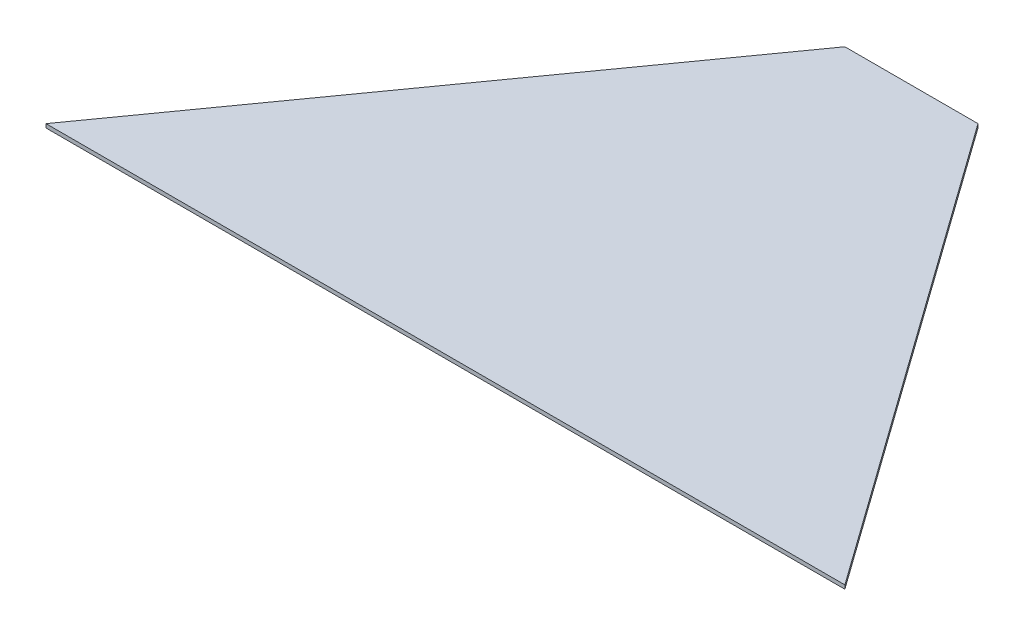
ISO-10303-21;
HEADER;
FILE_DESCRIPTION(('STEP AP214'),'2;1');
FILE_NAME('part.step','',(''),(''),'','','');
FILE_SCHEMA(('AUTOMOTIVE_DESIGN { 1 0 10303 214 1 1 1 1 }'));
ENDSEC;
DATA;
#1=APPLICATION_CONTEXT('core data for automotive mechanical design processes');
#2=APPLICATION_PROTOCOL_DEFINITION('international standard','automotive_design',2000,#1);
#3=PRODUCT_CONTEXT('',#1,'mechanical');
#4=PRODUCT('Part','Part','',(#3));
#5=PRODUCT_RELATED_PRODUCT_CATEGORY('part','',(#4));
#6=PRODUCT_DEFINITION_FORMATION('','',#4);
#7=PRODUCT_DEFINITION_CONTEXT('part definition',#1,'design');
#8=PRODUCT_DEFINITION('design','',#6,#7);
#9=PRODUCT_DEFINITION_SHAPE('','',#8);
#10=(LENGTH_UNIT() NAMED_UNIT(*) SI_UNIT(.MILLI.,.METRE.));
#11=(NAMED_UNIT(*) PLANE_ANGLE_UNIT() SI_UNIT($,.RADIAN.));
#12=(NAMED_UNIT(*) SI_UNIT($,.STERADIAN.) SOLID_ANGLE_UNIT());
#13=UNCERTAINTY_MEASURE_WITH_UNIT(LENGTH_MEASURE(1.E-05),#10,'distance_accuracy_value','');
#14=(GEOMETRIC_REPRESENTATION_CONTEXT(3) GLOBAL_UNCERTAINTY_ASSIGNED_CONTEXT((#13)) GLOBAL_UNIT_ASSIGNED_CONTEXT((#10,
#11,#12)) REPRESENTATION_CONTEXT('',''));
#15=CARTESIAN_POINT('',(0.,0.,0.));
#16=DIRECTION('',(0.,0.,1.));
#17=DIRECTION('',(1.,0.,0.));
#18=AXIS2_PLACEMENT_3D('',#15,#16,#17);
#19=CARTESIAN_POINT('',(-105.,1.,0.));
#20=DIRECTION('',(0.813733471206735,0.,0.581238193719096));
#21=DIRECTION('',(0.581238193719096,0.,-0.813733471206735));
#22=AXIS2_PLACEMENT_3D('',#19,#20,#21);
#23=PLANE('',#22);
#24=DIRECTION('',(-0.581238193719096,0.,0.813733471206735));
#25=VECTOR('',#24,1.);
#26=CARTESIAN_POINT('',(-105.,0.,0.));
#27=LINE('',#26,#25);
#28=CARTESIAN_POINT('',(-17.5,0.,-122.5));
#29=VERTEX_POINT('',#28);
#30=CARTESIAN_POINT('',(-105.,0.,0.));
#31=VERTEX_POINT('',#30);
#32=EDGE_CURVE('E96',#29,#31,#27,.T.);
#33=ORIENTED_EDGE('',*,*,#32,.T.);
#34=DIRECTION('',(0.,-1.,0.));
#35=VECTOR('',#34,1.);
#36=CARTESIAN_POINT('',(-105.,1.,0.));
#37=LINE('',#36,#35);
#38=CARTESIAN_POINT('',(-105.,1.,0.));
#39=VERTEX_POINT('',#38);
#40=EDGE_CURVE('E11',#39,#31,#37,.T.);
#41=ORIENTED_EDGE('',*,*,#40,.F.);
#42=DIRECTION('',(-0.581238193719096,0.,0.813733471206735));
#43=VECTOR('',#42,1.);
#44=CARTESIAN_POINT('',(-105.,1.,0.));
#45=LINE('',#44,#43);
#46=CARTESIAN_POINT('',(-17.5,1.,-122.5));
#47=VERTEX_POINT('',#46);
#48=EDGE_CURVE('E84',#47,#39,#45,.T.);
#49=ORIENTED_EDGE('',*,*,#48,.F.);
#50=DIRECTION('',(0.,-1.,0.));
#51=VECTOR('',#50,1.);
#52=CARTESIAN_POINT('',(-17.5,1.,-122.5));
#53=LINE('',#52,#51);
#54=EDGE_CURVE('E92',#47,#29,#53,.T.);
#55=ORIENTED_EDGE('',*,*,#54,.T.);
#56=EDGE_LOOP('',(#33,#41,#49,#55));
#57=FACE_BOUND('',#56,.T.);
#58=ADVANCED_FACE('F33',(#57),#23,.F.);
#59=CARTESIAN_POINT('',(105.,1.,0.));
#60=DIRECTION('',(0.,0.,-1.));
#61=DIRECTION('',(-1.,0.,0.));
#62=AXIS2_PLACEMENT_3D('',#59,#60,#61);
#63=PLANE('',#62);
#64=DIRECTION('',(1.,0.,0.));
#65=VECTOR('',#64,1.);
#66=CARTESIAN_POINT('',(105.,0.,0.));
#67=LINE('',#66,#65);
#68=CARTESIAN_POINT('',(105.,0.,0.));
#69=VERTEX_POINT('',#68);
#70=EDGE_CURVE('E88',#31,#69,#67,.T.);
#71=ORIENTED_EDGE('',*,*,#70,.T.);
#72=DIRECTION('',(0.,-1.,0.));
#73=VECTOR('',#72,1.);
#74=CARTESIAN_POINT('',(105.,1.,0.));
#75=LINE('',#74,#73);
#76=CARTESIAN_POINT('',(105.,1.,0.));
#77=VERTEX_POINT('',#76);
#78=EDGE_CURVE('E41',#77,#69,#75,.T.);
#79=ORIENTED_EDGE('',*,*,#78,.F.);
#80=DIRECTION('',(1.,0.,0.));
#81=VECTOR('',#80,1.);
#82=CARTESIAN_POINT('',(105.,1.,0.));
#83=LINE('',#82,#81);
#84=EDGE_CURVE('E79',#39,#77,#83,.T.);
#85=ORIENTED_EDGE('',*,*,#84,.F.);
#86=ORIENTED_EDGE('',*,*,#40,.T.);
#87=EDGE_LOOP('',(#71,#79,#85,#86));
#88=FACE_BOUND('',#87,.T.);
#89=ADVANCED_FACE('F87',(#88),#63,.F.);
#90=CARTESIAN_POINT('',(17.5,1.,-122.5));
#91=DIRECTION('',(-0.813733471206735,0.,0.581238193719097));
#92=DIRECTION('',(0.581238193719097,0.,0.813733471206735));
#93=AXIS2_PLACEMENT_3D('',#90,#91,#92);
#94=PLANE('',#93);
#95=DIRECTION('',(-0.581238193719097,0.,-0.813733471206735));
#96=VECTOR('',#95,1.);
#97=CARTESIAN_POINT('',(17.5,0.,-122.5));
#98=LINE('',#97,#96);
#99=CARTESIAN_POINT('',(17.5,0.,-122.5));
#100=VERTEX_POINT('',#99);
#101=EDGE_CURVE('E66',#69,#100,#98,.T.);
#102=ORIENTED_EDGE('',*,*,#101,.T.);
#103=DIRECTION('',(0.,-1.,0.));
#104=VECTOR('',#103,1.);
#105=CARTESIAN_POINT('',(17.5,1.,-122.5));
#106=LINE('',#105,#104);
#107=CARTESIAN_POINT('',(17.5,1.,-122.5));
#108=VERTEX_POINT('',#107);
#109=EDGE_CURVE('E89',#108,#100,#106,.T.);
#110=ORIENTED_EDGE('',*,*,#109,.F.);
#111=DIRECTION('',(-0.581238193719097,0.,-0.813733471206735));
#112=VECTOR('',#111,1.);
#113=CARTESIAN_POINT('',(17.5,1.,-122.5));
#114=LINE('',#113,#112);
#115=EDGE_CURVE('E82',#77,#108,#114,.T.);
#116=ORIENTED_EDGE('',*,*,#115,.F.);
#117=ORIENTED_EDGE('',*,*,#78,.T.);
#118=EDGE_LOOP('',(#102,#110,#116,#117));
#119=FACE_BOUND('',#118,.T.);
#120=ADVANCED_FACE('F90',(#119),#94,.F.);
#121=CARTESIAN_POINT('',(-17.5,1.,-122.5));
#122=DIRECTION('',(0.,0.,1.));
#123=DIRECTION('',(1.,0.,0.));
#124=AXIS2_PLACEMENT_3D('',#121,#122,#123);
#125=PLANE('',#124);
#126=DIRECTION('',(-1.,0.,0.));
#127=VECTOR('',#126,1.);
#128=CARTESIAN_POINT('',(-17.5,0.,-122.5));
#129=LINE('',#128,#127);
#130=EDGE_CURVE('E72',#100,#29,#129,.T.);
#131=ORIENTED_EDGE('',*,*,#130,.T.);
#132=ORIENTED_EDGE('',*,*,#54,.F.);
#133=DIRECTION('',(-1.,0.,0.));
#134=VECTOR('',#133,1.);
#135=CARTESIAN_POINT('',(-17.5,1.,-122.5));
#136=LINE('',#135,#134);
#137=EDGE_CURVE('E49',#108,#47,#136,.T.);
#138=ORIENTED_EDGE('',*,*,#137,.F.);
#139=ORIENTED_EDGE('',*,*,#109,.T.);
#140=EDGE_LOOP('',(#131,#132,#138,#139));
#141=FACE_BOUND('',#140,.T.);
#142=ADVANCED_FACE('F103',(#141),#125,.F.);
#143=CARTESIAN_POINT('',(0.,1.,0.));
#144=DIRECTION('',(0.,-1.,0.));
#145=DIRECTION('',(0.,0.,-1.));
#146=AXIS2_PLACEMENT_3D('',#143,#144,#145);
#147=PLANE('',#146);
#148=ORIENTED_EDGE('',*,*,#48,.T.);
#149=ORIENTED_EDGE('',*,*,#84,.T.);
#150=ORIENTED_EDGE('',*,*,#115,.T.);
#151=ORIENTED_EDGE('',*,*,#137,.T.);
#152=EDGE_LOOP('',(#148,#149,#150,#151));
#153=FACE_BOUND('',#152,.T.);
#154=ADVANCED_FACE('F80',(#153),#147,.F.);
#155=CARTESIAN_POINT('',(0.,0.,0.));
#156=DIRECTION('',(0.,-1.,0.));
#157=DIRECTION('',(0.,0.,-1.));
#158=AXIS2_PLACEMENT_3D('',#155,#156,#157);
#159=PLANE('',#158);
#160=ORIENTED_EDGE('',*,*,#32,.F.);
#161=ORIENTED_EDGE('',*,*,#130,.F.);
#162=ORIENTED_EDGE('',*,*,#101,.F.);
#163=ORIENTED_EDGE('',*,*,#70,.F.);
#164=EDGE_LOOP('',(#160,#161,#162,#163));
#165=FACE_BOUND('',#164,.T.);
#166=ADVANCED_FACE('F106',(#165),#159,.T.);
#167=CLOSED_SHELL('',(#58,#89,#120,#142,#154,#166));
#168=MANIFOLD_SOLID_BREP('B2',#167);
#169=ADVANCED_BREP_SHAPE_REPRESENTATION('',(#18,#168),#14);
#170=SHAPE_DEFINITION_REPRESENTATION(#9,#169);
ENDSEC;
END-ISO-10303-21;
